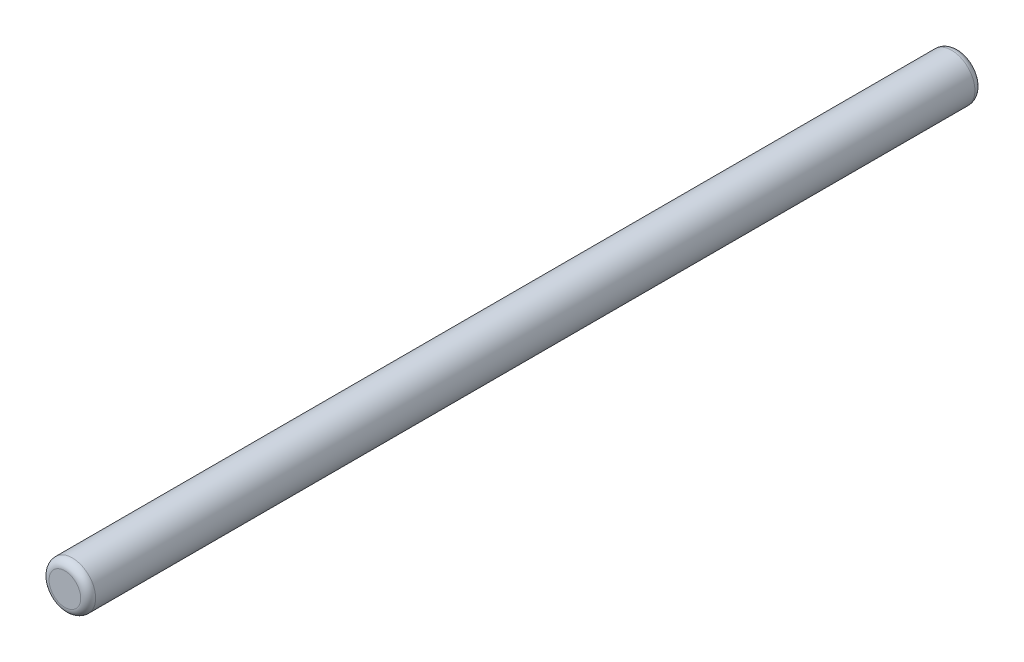
ISO-10303-21;
HEADER;
FILE_DESCRIPTION(('STEP AP214'),'2;1');
FILE_NAME('part.step','',(''),(''),'','','');
FILE_SCHEMA(('AUTOMOTIVE_DESIGN { 1 0 10303 214 1 1 1 1 }'));
ENDSEC;
DATA;
#1=APPLICATION_CONTEXT('core data for automotive mechanical design processes');
#2=APPLICATION_PROTOCOL_DEFINITION('international standard','automotive_design',2000,#1);
#3=PRODUCT_CONTEXT('',#1,'mechanical');
#4=PRODUCT('Part','Part','',(#3));
#5=PRODUCT_RELATED_PRODUCT_CATEGORY('part','',(#4));
#6=PRODUCT_DEFINITION_FORMATION('','',#4);
#7=PRODUCT_DEFINITION_CONTEXT('part definition',#1,'design');
#8=PRODUCT_DEFINITION('design','',#6,#7);
#9=PRODUCT_DEFINITION_SHAPE('','',#8);
#10=(LENGTH_UNIT() NAMED_UNIT(*) SI_UNIT(.MILLI.,.METRE.));
#11=(NAMED_UNIT(*) PLANE_ANGLE_UNIT() SI_UNIT($,.RADIAN.));
#12=(NAMED_UNIT(*) SI_UNIT($,.STERADIAN.) SOLID_ANGLE_UNIT());
#13=UNCERTAINTY_MEASURE_WITH_UNIT(LENGTH_MEASURE(1.E-05),#10,'distance_accuracy_value','');
#14=(GEOMETRIC_REPRESENTATION_CONTEXT(3) GLOBAL_UNCERTAINTY_ASSIGNED_CONTEXT((#13)) GLOBAL_UNIT_ASSIGNED_CONTEXT((#10,
#11,#12)) REPRESENTATION_CONTEXT('',''));
#15=CARTESIAN_POINT('',(0.,0.,0.));
#16=DIRECTION('',(0.,0.,1.));
#17=DIRECTION('',(1.,0.,0.));
#18=AXIS2_PLACEMENT_3D('',#15,#16,#17);
#19=CARTESIAN_POINT('',(0.,0.,96.));
#20=DIRECTION('',(0.,0.,-1.));
#21=DIRECTION('',(-1.,0.,0.));
#22=AXIS2_PLACEMENT_3D('',#19,#20,#21);
#23=CYLINDRICAL_SURFACE('',#22,2.5);
#24=CARTESIAN_POINT('',(0.,0.,0.799999999999995));
#25=DIRECTION('',(0.,0.,1.));
#26=DIRECTION('',(1.,0.,0.));
#27=AXIS2_PLACEMENT_3D('',#24,#25,#26);
#28=CIRCLE('',#27,2.5);
#29=CARTESIAN_POINT('',(2.5,0.,0.799999999999995));
#30=VERTEX_POINT('',#29);
#31=EDGE_CURVE('E47',#30,#30,#28,.T.);
#32=ORIENTED_EDGE('',*,*,#31,.T.);
#33=EDGE_LOOP('',(#32));
#34=FACE_BOUND('',#33,.T.);
#35=CARTESIAN_POINT('',(0.,0.,95.2));
#36=DIRECTION('',(0.,0.,1.));
#37=DIRECTION('',(1.,0.,0.));
#38=AXIS2_PLACEMENT_3D('',#35,#36,#37);
#39=CIRCLE('',#38,2.5);
#40=CARTESIAN_POINT('',(2.5,0.,95.2));
#41=VERTEX_POINT('',#40);
#42=EDGE_CURVE('E51',#41,#41,#39,.F.);
#43=ORIENTED_EDGE('',*,*,#42,.T.);
#44=EDGE_LOOP('',(#43));
#45=FACE_BOUND('',#44,.T.);
#46=ADVANCED_FACE('F40',(#34,#45),#23,.T.);
#47=CARTESIAN_POINT('',(0.,0.,96.));
#48=DIRECTION('',(0.,0.,1.));
#49=DIRECTION('',(1.,0.,0.));
#50=AXIS2_PLACEMENT_3D('',#47,#48,#49);
#51=PLANE('',#50);
#52=CARTESIAN_POINT('',(0.,0.,96.));
#53=DIRECTION('',(0.,0.,1.));
#54=DIRECTION('',(1.,0.,0.));
#55=AXIS2_PLACEMENT_3D('',#52,#53,#54);
#56=CIRCLE('',#55,1.7);
#57=CARTESIAN_POINT('',(1.7,0.,96.));
#58=VERTEX_POINT('',#57);
#59=EDGE_CURVE('E55',#58,#58,#56,.T.);
#60=ORIENTED_EDGE('',*,*,#59,.T.);
#61=EDGE_LOOP('',(#60));
#62=FACE_BOUND('',#61,.T.);
#63=ADVANCED_FACE('F61',(#62),#51,.T.);
#64=CARTESIAN_POINT('',(0.,0.,0.));
#65=DIRECTION('',(0.,0.,1.));
#66=DIRECTION('',(1.,0.,0.));
#67=AXIS2_PLACEMENT_3D('',#64,#65,#66);
#68=PLANE('',#67);
#69=CARTESIAN_POINT('',(0.,0.,0.));
#70=DIRECTION('',(0.,0.,1.));
#71=DIRECTION('',(1.,0.,0.));
#72=AXIS2_PLACEMENT_3D('',#69,#70,#71);
#73=CIRCLE('',#72,1.7);
#74=CARTESIAN_POINT('',(1.7,0.,0.));
#75=VERTEX_POINT('',#74);
#76=EDGE_CURVE('E10',#75,#75,#73,.F.);
#77=ORIENTED_EDGE('',*,*,#76,.T.);
#78=EDGE_LOOP('',(#77));
#79=FACE_BOUND('',#78,.T.);
#80=ADVANCED_FACE('F65',(#79),#68,.F.);
#81=CARTESIAN_POINT('',(0.,0.,95.2));
#82=DIRECTION('',(0.,0.,1.));
#83=DIRECTION('',(1.,0.,0.));
#84=AXIS2_PLACEMENT_3D('',#81,#82,#83);
#85=TOROIDAL_SURFACE('',#84,1.7,0.8);
#86=ORIENTED_EDGE('',*,*,#42,.F.);
#87=EDGE_LOOP('',(#86));
#88=FACE_BOUND('',#87,.T.);
#89=ORIENTED_EDGE('',*,*,#59,.F.);
#90=EDGE_LOOP('',(#89));
#91=FACE_BOUND('',#90,.T.);
#92=ADVANCED_FACE('F63',(#88,#91),#85,.T.);
#93=CARTESIAN_POINT('',(0.,0.,0.799999999999995));
#94=DIRECTION('',(0.,0.,1.));
#95=DIRECTION('',(1.,0.,0.));
#96=AXIS2_PLACEMENT_3D('',#93,#94,#95);
#97=TOROIDAL_SURFACE('',#96,1.7,0.8);
#98=ORIENTED_EDGE('',*,*,#76,.F.);
#99=EDGE_LOOP('',(#98));
#100=FACE_BOUND('',#99,.T.);
#101=ORIENTED_EDGE('',*,*,#31,.F.);
#102=EDGE_LOOP('',(#101));
#103=FACE_BOUND('',#102,.T.);
#104=ADVANCED_FACE('F42',(#100,#103),#97,.T.);
#105=CLOSED_SHELL('',(#46,#63,#80,#92,#104));
#106=MANIFOLD_SOLID_BREP('B2',#105);
#107=ADVANCED_BREP_SHAPE_REPRESENTATION('',(#18,#106),#14);
#108=SHAPE_DEFINITION_REPRESENTATION(#9,#107);
ENDSEC;
END-ISO-10303-21;
